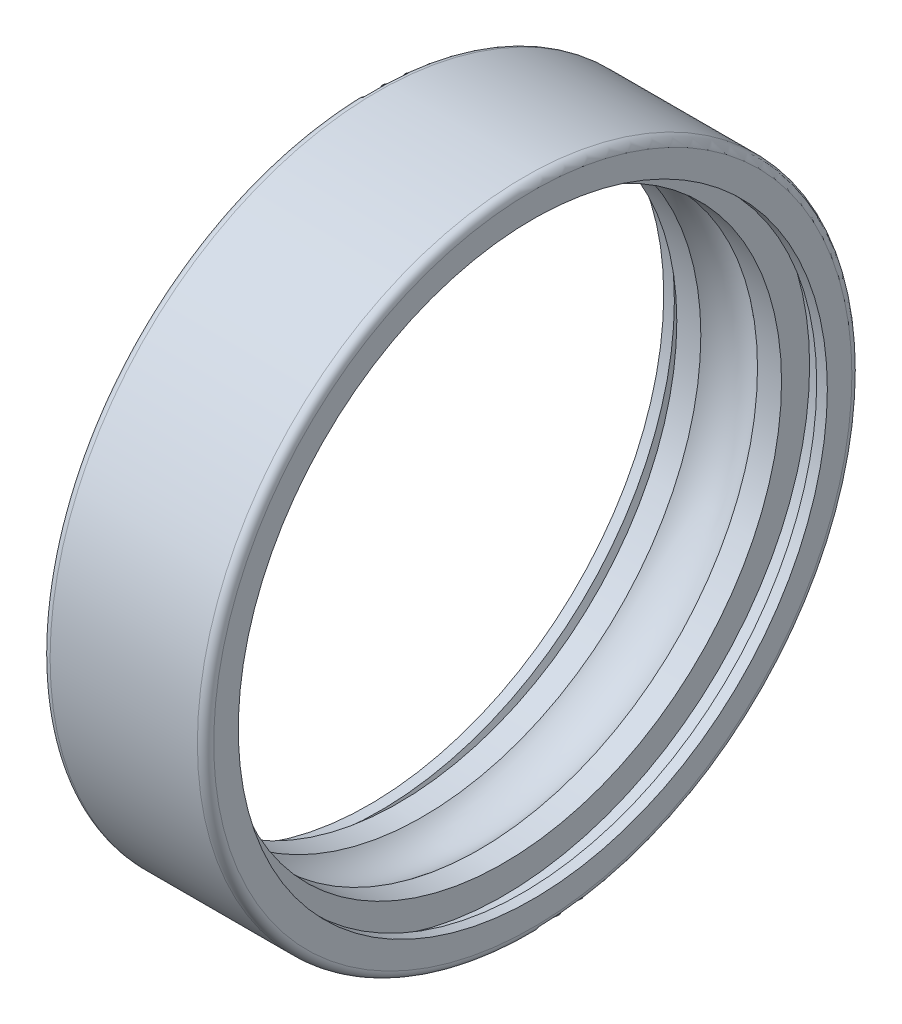
ISO-10303-21;
HEADER;
FILE_DESCRIPTION(('STEP AP214'),'2;1');
FILE_NAME('part.step','',(''),(''),'','','');
FILE_SCHEMA(('AUTOMOTIVE_DESIGN { 1 0 10303 214 1 1 1 1 }'));
ENDSEC;
DATA;
#1=APPLICATION_CONTEXT('core data for automotive mechanical design processes');
#2=APPLICATION_PROTOCOL_DEFINITION('international standard','automotive_design',2000,#1);
#3=PRODUCT_CONTEXT('',#1,'mechanical');
#4=PRODUCT('Part','Part','',(#3));
#5=PRODUCT_RELATED_PRODUCT_CATEGORY('part','',(#4));
#6=PRODUCT_DEFINITION_FORMATION('','',#4);
#7=PRODUCT_DEFINITION_CONTEXT('part definition',#1,'design');
#8=PRODUCT_DEFINITION('design','',#6,#7);
#9=PRODUCT_DEFINITION_SHAPE('','',#8);
#10=(LENGTH_UNIT() NAMED_UNIT(*) SI_UNIT(.MILLI.,.METRE.));
#11=(NAMED_UNIT(*) PLANE_ANGLE_UNIT() SI_UNIT($,.RADIAN.));
#12=(NAMED_UNIT(*) SI_UNIT($,.STERADIAN.) SOLID_ANGLE_UNIT());
#13=UNCERTAINTY_MEASURE_WITH_UNIT(LENGTH_MEASURE(1.E-05),#10,'distance_accuracy_value','');
#14=(GEOMETRIC_REPRESENTATION_CONTEXT(3) GLOBAL_UNCERTAINTY_ASSIGNED_CONTEXT((#13)) GLOBAL_UNIT_ASSIGNED_CONTEXT((#10,
#11,#12)) REPRESENTATION_CONTEXT('',''));
#15=CARTESIAN_POINT('',(0.,0.,0.));
#16=DIRECTION('',(0.,0.,1.));
#17=DIRECTION('',(1.,0.,0.));
#18=AXIS2_PLACEMENT_3D('',#15,#16,#17);
#19=CARTESIAN_POINT('',(0.,11.7,0.));
#20=DIRECTION('',(-1.,0.,0.));
#21=DIRECTION('',(0.,0.,1.));
#22=AXIS2_PLACEMENT_3D('',#19,#20,#21);
#23=PLANE('',#22);
#24=CARTESIAN_POINT('',(0.,0.,0.));
#25=DIRECTION('',(1.,0.,0.));
#26=DIRECTION('',(0.,0.,-1.));
#27=AXIS2_PLACEMENT_3D('',#24,#25,#26);
#28=CIRCLE('',#27,10.8);
#29=CARTESIAN_POINT('',(0.,0.,-10.8));
#30=VERTEX_POINT('',#29);
#31=EDGE_CURVE('E69',#30,#30,#28,.T.);
#32=ORIENTED_EDGE('',*,*,#31,.T.);
#33=EDGE_LOOP('',(#32));
#34=FACE_BOUND('',#33,.T.);
#35=CARTESIAN_POINT('',(0.,0.,0.));
#36=DIRECTION('',(1.,0.,0.));
#37=DIRECTION('',(0.,0.,-1.));
#38=AXIS2_PLACEMENT_3D('',#35,#36,#37);
#39=CIRCLE('',#38,11.7000000154857);
#40=CARTESIAN_POINT('',(0.,0.,-11.7000000154857));
#41=VERTEX_POINT('',#40);
#42=EDGE_CURVE('E63',#41,#41,#39,.T.);
#43=ORIENTED_EDGE('',*,*,#42,.F.);
#44=EDGE_LOOP('',(#43));
#45=FACE_BOUND('',#44,.T.);
#46=ADVANCED_FACE('F14',(#34,#45),#23,.T.);
#47=CARTESIAN_POINT('',(6.,0.,0.));
#48=DIRECTION('',(1.,0.,0.));
#49=DIRECTION('',(0.,0.,-1.));
#50=AXIS2_PLACEMENT_3D('',#47,#48,#49);
#51=CYLINDRICAL_SURFACE('',#50,10.8);
#52=CARTESIAN_POINT('',(0.39060981899337,0.,0.));
#53=DIRECTION('',(1.,0.,0.));
#54=DIRECTION('',(0.,0.,-1.));
#55=AXIS2_PLACEMENT_3D('',#52,#53,#54);
#56=CIRCLE('',#55,10.8);
#57=CARTESIAN_POINT('',(0.39060981899337,0.,-10.8));
#58=VERTEX_POINT('',#57);
#59=EDGE_CURVE('E61',#58,#58,#56,.T.);
#60=ORIENTED_EDGE('',*,*,#59,.T.);
#61=EDGE_LOOP('',(#60));
#62=FACE_BOUND('',#61,.T.);
#63=ORIENTED_EDGE('',*,*,#31,.F.);
#64=EDGE_LOOP('',(#63));
#65=FACE_BOUND('',#64,.T.);
#66=ADVANCED_FACE('F73',(#62,#65),#51,.F.);
#67=CARTESIAN_POINT('',(0.39060981899337,0.,0.));
#68=DIRECTION('',(1.,0.,0.));
#69=DIRECTION('',(0.,0.,-1.));
#70=AXIS2_PLACEMENT_3D('',#67,#68,#69);
#71=CONICAL_SURFACE('',#70,10.8,1.14109666064346);
#72=CARTESIAN_POINT('',(0.58747727084868,0.,0.));
#73=DIRECTION('',(1.,0.,0.));
#74=DIRECTION('',(0.,0.,-1.));
#75=AXIS2_PLACEMENT_3D('',#72,#73,#74);
#76=CIRCLE('',#75,11.2296);
#77=CARTESIAN_POINT('',(0.58747727084868,0.,-11.2296));
#78=VERTEX_POINT('',#77);
#79=EDGE_CURVE('E59',#78,#78,#76,.T.);
#80=ORIENTED_EDGE('',*,*,#79,.T.);
#81=EDGE_LOOP('',(#80));
#82=FACE_BOUND('',#81,.T.);
#83=ORIENTED_EDGE('',*,*,#59,.F.);
#84=EDGE_LOOP('',(#83));
#85=FACE_BOUND('',#84,.T.);
#86=ADVANCED_FACE('F74',(#82,#85),#71,.F.);
#87=CARTESIAN_POINT('',(6.,0.,0.));
#88=DIRECTION('',(1.,0.,0.));
#89=DIRECTION('',(0.,0.,-1.));
#90=AXIS2_PLACEMENT_3D('',#87,#88,#89);
#91=CYLINDRICAL_SURFACE('',#90,11.2296);
#92=CARTESIAN_POINT('',(1.08,0.,0.));
#93=DIRECTION('',(1.,0.,0.));
#94=DIRECTION('',(0.,0.,-1.));
#95=AXIS2_PLACEMENT_3D('',#92,#93,#94);
#96=CIRCLE('',#95,11.2296);
#97=CARTESIAN_POINT('',(1.08,0.,-11.2296));
#98=VERTEX_POINT('',#97);
#99=EDGE_CURVE('E54',#98,#98,#96,.T.);
#100=ORIENTED_EDGE('',*,*,#99,.T.);
#101=EDGE_LOOP('',(#100));
#102=FACE_BOUND('',#101,.T.);
#103=ORIENTED_EDGE('',*,*,#79,.F.);
#104=EDGE_LOOP('',(#103));
#105=FACE_BOUND('',#104,.T.);
#106=ADVANCED_FACE('F84',(#102,#105),#91,.F.);
#107=CARTESIAN_POINT('',(1.08,11.2296,0.));
#108=DIRECTION('',(-1.,0.,0.));
#109=DIRECTION('',(0.,0.,1.));
#110=AXIS2_PLACEMENT_3D('',#107,#108,#109);
#111=PLANE('',#110);
#112=CARTESIAN_POINT('',(1.08,0.,0.));
#113=DIRECTION('',(1.,0.,0.));
#114=DIRECTION('',(0.,0.,-1.));
#115=AXIS2_PLACEMENT_3D('',#112,#113,#114);
#116=CIRCLE('',#115,10.2);
#117=CARTESIAN_POINT('',(1.08,0.,-10.2));
#118=VERTEX_POINT('',#117);
#119=EDGE_CURVE('E55',#118,#118,#116,.T.);
#120=ORIENTED_EDGE('',*,*,#119,.T.);
#121=EDGE_LOOP('',(#120));
#122=FACE_BOUND('',#121,.T.);
#123=ORIENTED_EDGE('',*,*,#99,.F.);
#124=EDGE_LOOP('',(#123));
#125=FACE_BOUND('',#124,.T.);
#126=ADVANCED_FACE('F89',(#122,#125),#111,.T.);
#127=CARTESIAN_POINT('',(6.,0.,0.));
#128=DIRECTION('',(1.,0.,0.));
#129=DIRECTION('',(0.,0.,-1.));
#130=AXIS2_PLACEMENT_3D('',#127,#128,#129);
#131=CYLINDRICAL_SURFACE('',#130,10.2);
#132=CARTESIAN_POINT('',(1.9606943423612,0.,0.));
#133=DIRECTION('',(1.,0.,0.));
#134=DIRECTION('',(0.,0.,-1.));
#135=AXIS2_PLACEMENT_3D('',#132,#133,#134);
#136=CIRCLE('',#135,10.2);
#137=CARTESIAN_POINT('',(1.9606943423612,0.,-10.2));
#138=VERTEX_POINT('',#137);
#139=EDGE_CURVE('E47',#138,#138,#136,.T.);
#140=ORIENTED_EDGE('',*,*,#139,.T.);
#141=EDGE_LOOP('',(#140));
#142=FACE_BOUND('',#141,.T.);
#143=ORIENTED_EDGE('',*,*,#119,.F.);
#144=EDGE_LOOP('',(#143));
#145=FACE_BOUND('',#144,.T.);
#146=ADVANCED_FACE('F94',(#142,#145),#131,.F.);
#147=CARTESIAN_POINT('',(3.,0.,0.));
#148=DIRECTION('',(1.,0.,0.));
#149=DIRECTION('',(0.,0.,-1.));
#150=AXIS2_PLACEMENT_3D('',#147,#148,#149);
#151=TOROIDAL_SURFACE('',#150,9.,1.5875);
#152=ORIENTED_EDGE('',*,*,#139,.F.);
#153=EDGE_LOOP('',(#152));
#154=FACE_BOUND('',#153,.T.);
#155=CARTESIAN_POINT('',(4.0393056576388,0.,0.));
#156=DIRECTION('',(1.,0.,0.));
#157=DIRECTION('',(0.,0.,-1.));
#158=AXIS2_PLACEMENT_3D('',#155,#156,#157);
#159=CIRCLE('',#158,10.2);
#160=CARTESIAN_POINT('',(4.0393056576388,0.,-10.2));
#161=VERTEX_POINT('',#160);
#162=EDGE_CURVE('E46',#161,#161,#159,.T.);
#163=ORIENTED_EDGE('',*,*,#162,.T.);
#164=EDGE_LOOP('',(#163));
#165=FACE_BOUND('',#164,.T.);
#166=ADVANCED_FACE('F98',(#154,#165),#151,.F.);
#167=CARTESIAN_POINT('',(6.,0.,0.));
#168=DIRECTION('',(1.,0.,0.));
#169=DIRECTION('',(0.,0.,-1.));
#170=AXIS2_PLACEMENT_3D('',#167,#168,#169);
#171=CYLINDRICAL_SURFACE('',#170,10.2);
#172=CARTESIAN_POINT('',(4.92,0.,0.));
#173=DIRECTION('',(1.,0.,0.));
#174=DIRECTION('',(0.,0.,-1.));
#175=AXIS2_PLACEMENT_3D('',#172,#173,#174);
#176=CIRCLE('',#175,10.2);
#177=CARTESIAN_POINT('',(4.92,0.,-10.2));
#178=VERTEX_POINT('',#177);
#179=EDGE_CURVE('E43',#178,#178,#176,.T.);
#180=ORIENTED_EDGE('',*,*,#179,.T.);
#181=EDGE_LOOP('',(#180));
#182=FACE_BOUND('',#181,.T.);
#183=ORIENTED_EDGE('',*,*,#162,.F.);
#184=EDGE_LOOP('',(#183));
#185=FACE_BOUND('',#184,.T.);
#186=ADVANCED_FACE('F105',(#182,#185),#171,.F.);
#187=CARTESIAN_POINT('',(4.92,10.2,0.));
#188=DIRECTION('',(1.,0.,0.));
#189=DIRECTION('',(0.,0.,-1.));
#190=AXIS2_PLACEMENT_3D('',#187,#188,#189);
#191=PLANE('',#190);
#192=CARTESIAN_POINT('',(4.92,0.,0.));
#193=DIRECTION('',(1.,0.,0.));
#194=DIRECTION('',(0.,0.,-1.));
#195=AXIS2_PLACEMENT_3D('',#192,#193,#194);
#196=CIRCLE('',#195,11.2296);
#197=CARTESIAN_POINT('',(4.92,0.,-11.2296));
#198=VERTEX_POINT('',#197);
#199=EDGE_CURVE('E37',#198,#198,#196,.T.);
#200=ORIENTED_EDGE('',*,*,#199,.T.);
#201=EDGE_LOOP('',(#200));
#202=FACE_BOUND('',#201,.T.);
#203=ORIENTED_EDGE('',*,*,#179,.F.);
#204=EDGE_LOOP('',(#203));
#205=FACE_BOUND('',#204,.T.);
#206=ADVANCED_FACE('F106',(#202,#205),#191,.T.);
#207=CARTESIAN_POINT('',(6.,0.,0.));
#208=DIRECTION('',(1.,0.,0.));
#209=DIRECTION('',(0.,0.,-1.));
#210=AXIS2_PLACEMENT_3D('',#207,#208,#209);
#211=CYLINDRICAL_SURFACE('',#210,11.2296);
#212=CARTESIAN_POINT('',(5.4125227291513,0.,0.));
#213=DIRECTION('',(1.,0.,0.));
#214=DIRECTION('',(0.,0.,-1.));
#215=AXIS2_PLACEMENT_3D('',#212,#213,#214);
#216=CIRCLE('',#215,11.2296);
#217=CARTESIAN_POINT('',(5.4125227291513,0.,-11.2296));
#218=VERTEX_POINT('',#217);
#219=EDGE_CURVE('E40',#218,#218,#216,.T.);
#220=ORIENTED_EDGE('',*,*,#219,.T.);
#221=EDGE_LOOP('',(#220));
#222=FACE_BOUND('',#221,.T.);
#223=ORIENTED_EDGE('',*,*,#199,.F.);
#224=EDGE_LOOP('',(#223));
#225=FACE_BOUND('',#224,.T.);
#226=ADVANCED_FACE('F109',(#222,#225),#211,.F.);
#227=CARTESIAN_POINT('',(5.4125227291513,0.,0.));
#228=DIRECTION('',(-1.,0.,0.));
#229=DIRECTION('',(0.,0.,1.));
#230=AXIS2_PLACEMENT_3D('',#227,#228,#229);
#231=CONICAL_SURFACE('',#230,11.2296,1.14109666064348);
#232=CARTESIAN_POINT('',(5.6093901810066,0.,0.));
#233=DIRECTION('',(1.,0.,0.));
#234=DIRECTION('',(0.,0.,-1.));
#235=AXIS2_PLACEMENT_3D('',#232,#233,#234);
#236=CIRCLE('',#235,10.8);
#237=CARTESIAN_POINT('',(5.6093901810066,0.,-10.8));
#238=VERTEX_POINT('',#237);
#239=EDGE_CURVE('E35',#238,#238,#236,.T.);
#240=ORIENTED_EDGE('',*,*,#239,.T.);
#241=EDGE_LOOP('',(#240));
#242=FACE_BOUND('',#241,.T.);
#243=ORIENTED_EDGE('',*,*,#219,.F.);
#244=EDGE_LOOP('',(#243));
#245=FACE_BOUND('',#244,.T.);
#246=ADVANCED_FACE('F111',(#242,#245),#231,.F.);
#247=CARTESIAN_POINT('',(6.,0.,0.));
#248=DIRECTION('',(1.,0.,0.));
#249=DIRECTION('',(0.,0.,-1.));
#250=AXIS2_PLACEMENT_3D('',#247,#248,#249);
#251=CYLINDRICAL_SURFACE('',#250,10.8);
#252=CARTESIAN_POINT('',(6.,0.,0.));
#253=DIRECTION('',(1.,0.,0.));
#254=DIRECTION('',(0.,0.,-1.));
#255=AXIS2_PLACEMENT_3D('',#252,#253,#254);
#256=CIRCLE('',#255,10.8);
#257=CARTESIAN_POINT('',(6.,0.,-10.8));
#258=VERTEX_POINT('',#257);
#259=EDGE_CURVE('E26',#258,#258,#256,.T.);
#260=ORIENTED_EDGE('',*,*,#259,.T.);
#261=EDGE_LOOP('',(#260));
#262=FACE_BOUND('',#261,.T.);
#263=ORIENTED_EDGE('',*,*,#239,.F.);
#264=EDGE_LOOP('',(#263));
#265=FACE_BOUND('',#264,.T.);
#266=ADVANCED_FACE('F119',(#262,#265),#251,.F.);
#267=CARTESIAN_POINT('',(6.,10.8,0.));
#268=DIRECTION('',(1.,0.,0.));
#269=DIRECTION('',(0.,0.,-1.));
#270=AXIS2_PLACEMENT_3D('',#267,#268,#269);
#271=PLANE('',#270);
#272=CARTESIAN_POINT('',(6.,0.,0.));
#273=DIRECTION('',(1.,0.,0.));
#274=DIRECTION('',(0.,0.,-1.));
#275=AXIS2_PLACEMENT_3D('',#272,#273,#274);
#276=CIRCLE('',#275,11.6999999467298);
#277=CARTESIAN_POINT('',(6.,0.,-11.6999999467298));
#278=VERTEX_POINT('',#277);
#279=EDGE_CURVE('E25',#278,#278,#276,.T.);
#280=ORIENTED_EDGE('',*,*,#279,.T.);
#281=EDGE_LOOP('',(#280));
#282=FACE_BOUND('',#281,.T.);
#283=ORIENTED_EDGE('',*,*,#259,.F.);
#284=EDGE_LOOP('',(#283));
#285=FACE_BOUND('',#284,.T.);
#286=ADVANCED_FACE('F124',(#282,#285),#271,.T.);
#287=CARTESIAN_POINT('',(5.70000000000013,0.,0.));
#288=DIRECTION('',(1.,0.,0.));
#289=DIRECTION('',(0.,0.,-1.));
#290=AXIS2_PLACEMENT_3D('',#287,#288,#289);
#291=TOROIDAL_SURFACE('',#290,11.7000000000001,0.299999999999874);
#292=CARTESIAN_POINT('',(5.7,0.,0.));
#293=DIRECTION('',(1.,0.,0.));
#294=DIRECTION('',(0.,0.,-1.));
#295=AXIS2_PLACEMENT_3D('',#292,#293,#294);
#296=CIRCLE('',#295,12.);
#297=CARTESIAN_POINT('',(5.7,0.,-12.));
#298=VERTEX_POINT('',#297);
#299=EDGE_CURVE('E21',#298,#298,#296,.T.);
#300=ORIENTED_EDGE('',*,*,#299,.T.);
#301=EDGE_LOOP('',(#300));
#302=FACE_BOUND('',#301,.T.);
#303=ORIENTED_EDGE('',*,*,#279,.F.);
#304=EDGE_LOOP('',(#303));
#305=FACE_BOUND('',#304,.T.);
#306=ADVANCED_FACE('F130',(#302,#305),#291,.T.);
#307=CARTESIAN_POINT('',(6.,0.,0.));
#308=DIRECTION('',(1.,0.,0.));
#309=DIRECTION('',(0.,0.,-1.));
#310=AXIS2_PLACEMENT_3D('',#307,#308,#309);
#311=CYLINDRICAL_SURFACE('',#310,12.);
#312=CARTESIAN_POINT('',(0.3,0.,0.));
#313=DIRECTION('',(1.,0.,0.));
#314=DIRECTION('',(0.,0.,-1.));
#315=AXIS2_PLACEMENT_3D('',#312,#313,#314);
#316=CIRCLE('',#315,12.);
#317=CARTESIAN_POINT('',(0.3,0.,-12.));
#318=VERTEX_POINT('',#317);
#319=EDGE_CURVE('E10',#318,#318,#316,.T.);
#320=ORIENTED_EDGE('',*,*,#319,.T.);
#321=EDGE_LOOP('',(#320));
#322=FACE_BOUND('',#321,.T.);
#323=ORIENTED_EDGE('',*,*,#299,.F.);
#324=EDGE_LOOP('',(#323));
#325=FACE_BOUND('',#324,.T.);
#326=ADVANCED_FACE('F127',(#322,#325),#311,.T.);
#327=CARTESIAN_POINT('',(0.299999999999936,0.,0.));
#328=DIRECTION('',(1.,0.,0.));
#329=DIRECTION('',(0.,0.,-1.));
#330=AXIS2_PLACEMENT_3D('',#327,#328,#329);
#331=TOROIDAL_SURFACE('',#330,11.7,0.299999999999936);
#332=ORIENTED_EDGE('',*,*,#42,.T.);
#333=EDGE_LOOP('',(#332));
#334=FACE_BOUND('',#333,.T.);
#335=ORIENTED_EDGE('',*,*,#319,.F.);
#336=EDGE_LOOP('',(#335));
#337=FACE_BOUND('',#336,.T.);
#338=ADVANCED_FACE('F16',(#334,#337),#331,.T.);
#339=CLOSED_SHELL('',(#46,#66,#86,#106,#126,#146,#166,#186,#206,#226,#246,#266,#286,#306,#326,#338));
#340=MANIFOLD_SOLID_BREP('B1',#339);
#341=ADVANCED_BREP_SHAPE_REPRESENTATION('',(#18,#340),#14);
#342=SHAPE_DEFINITION_REPRESENTATION(#9,#341);
ENDSEC;
END-ISO-10303-21;
